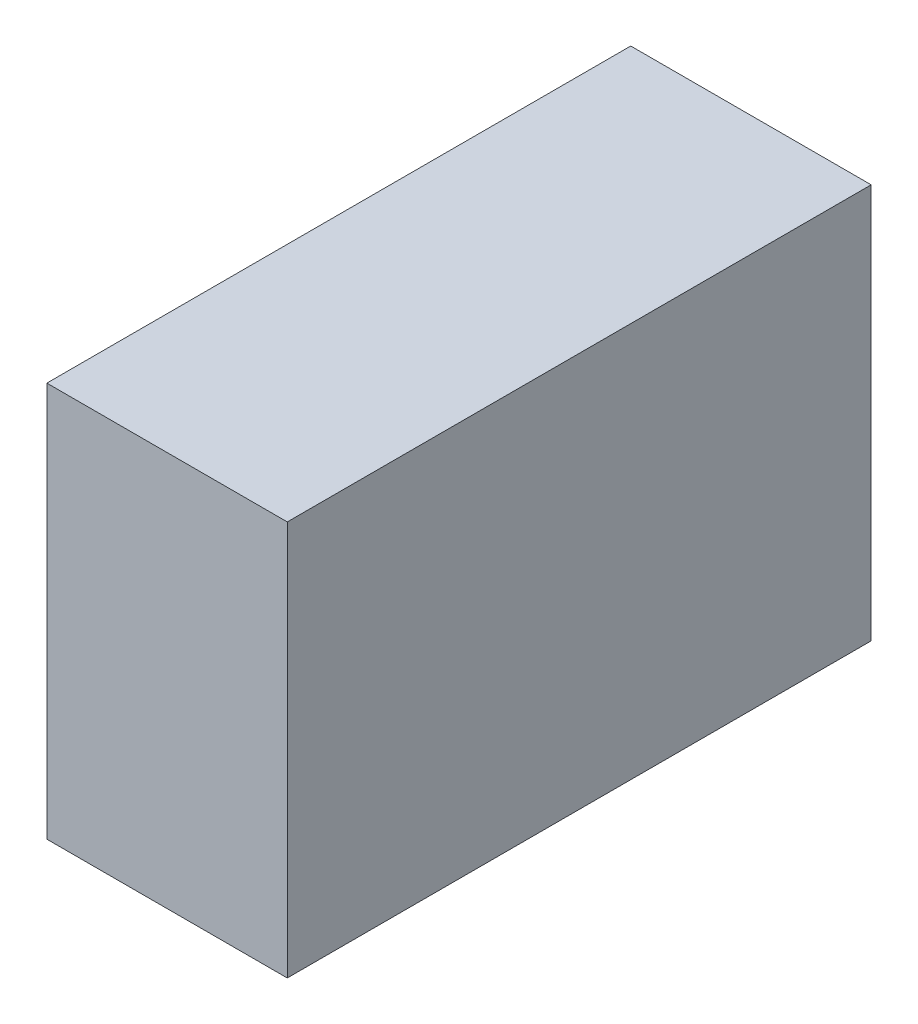
ISO-10303-21;
HEADER;
FILE_DESCRIPTION(('STEP AP214'),'2;1');
FILE_NAME('part.step','',(''),(''),'','','');
FILE_SCHEMA(('AUTOMOTIVE_DESIGN { 1 0 10303 214 1 1 1 1 }'));
ENDSEC;
DATA;
#1=APPLICATION_CONTEXT('core data for automotive mechanical design processes');
#2=APPLICATION_PROTOCOL_DEFINITION('international standard','automotive_design',2000,#1);
#3=PRODUCT_CONTEXT('',#1,'mechanical');
#4=PRODUCT('Part','Part','',(#3));
#5=PRODUCT_RELATED_PRODUCT_CATEGORY('part','',(#4));
#6=PRODUCT_DEFINITION_FORMATION('','',#4);
#7=PRODUCT_DEFINITION_CONTEXT('part definition',#1,'design');
#8=PRODUCT_DEFINITION('design','',#6,#7);
#9=PRODUCT_DEFINITION_SHAPE('','',#8);
#10=(LENGTH_UNIT() NAMED_UNIT(*) SI_UNIT(.MILLI.,.METRE.));
#11=(NAMED_UNIT(*) PLANE_ANGLE_UNIT() SI_UNIT($,.RADIAN.));
#12=(NAMED_UNIT(*) SI_UNIT($,.STERADIAN.) SOLID_ANGLE_UNIT());
#13=UNCERTAINTY_MEASURE_WITH_UNIT(LENGTH_MEASURE(1.E-05),#10,'distance_accuracy_value','');
#14=(GEOMETRIC_REPRESENTATION_CONTEXT(3) GLOBAL_UNCERTAINTY_ASSIGNED_CONTEXT((#13)) GLOBAL_UNIT_ASSIGNED_CONTEXT((#10,
#11,#12)) REPRESENTATION_CONTEXT('',''));
#15=CARTESIAN_POINT('',(0.,0.,0.));
#16=DIRECTION('',(0.,0.,1.));
#17=DIRECTION('',(1.,0.,0.));
#18=AXIS2_PLACEMENT_3D('',#15,#16,#17);
#19=CARTESIAN_POINT('',(35.56,0.,0.));
#20=DIRECTION('',(0.,0.,-1.));
#21=DIRECTION('',(-1.,0.,0.));
#22=AXIS2_PLACEMENT_3D('',#19,#20,#21);
#23=PLANE('',#22);
#24=DIRECTION('',(0.,-1.,0.));
#25=VECTOR('',#24,1.);
#26=CARTESIAN_POINT('',(0.,0.,0.));
#27=LINE('',#26,#25);
#28=CARTESIAN_POINT('',(0.,58.42,0.));
#29=VERTEX_POINT('',#28);
#30=CARTESIAN_POINT('',(0.,0.,0.));
#31=VERTEX_POINT('',#30);
#32=EDGE_CURVE('E107',#29,#31,#27,.T.);
#33=ORIENTED_EDGE('',*,*,#32,.T.);
#34=DIRECTION('',(-1.,0.,0.));
#35=VECTOR('',#34,1.);
#36=CARTESIAN_POINT('',(35.56,0.,0.));
#37=LINE('',#36,#35);
#38=CARTESIAN_POINT('',(35.56,0.,0.));
#39=VERTEX_POINT('',#38);
#40=EDGE_CURVE('E11',#39,#31,#37,.T.);
#41=ORIENTED_EDGE('',*,*,#40,.F.);
#42=DIRECTION('',(0.,-1.,0.));
#43=VECTOR('',#42,1.);
#44=CARTESIAN_POINT('',(35.56,0.,0.));
#45=LINE('',#44,#43);
#46=CARTESIAN_POINT('',(35.56,58.42,0.));
#47=VERTEX_POINT('',#46);
#48=EDGE_CURVE('E91',#47,#39,#45,.T.);
#49=ORIENTED_EDGE('',*,*,#48,.F.);
#50=DIRECTION('',(-1.,0.,0.));
#51=VECTOR('',#50,1.);
#52=CARTESIAN_POINT('',(35.56,58.42,0.));
#53=LINE('',#52,#51);
#54=EDGE_CURVE('E103',#47,#29,#53,.T.);
#55=ORIENTED_EDGE('',*,*,#54,.T.);
#56=EDGE_LOOP('',(#33,#41,#49,#55));
#57=FACE_BOUND('',#56,.T.);
#58=ADVANCED_FACE('F39',(#57),#23,.F.);
#59=CARTESIAN_POINT('',(35.56,0.,0.));
#60=DIRECTION('',(0.,1.,0.));
#61=DIRECTION('',(0.,0.,1.));
#62=AXIS2_PLACEMENT_3D('',#59,#60,#61);
#63=PLANE('',#62);
#64=DIRECTION('',(0.,0.,-1.));
#65=VECTOR('',#64,1.);
#66=CARTESIAN_POINT('',(0.,0.,0.));
#67=LINE('',#66,#65);
#68=CARTESIAN_POINT('',(0.,0.,-86.36));
#69=VERTEX_POINT('',#68);
#70=EDGE_CURVE('E96',#31,#69,#67,.T.);
#71=ORIENTED_EDGE('',*,*,#70,.T.);
#72=DIRECTION('',(-1.,0.,0.));
#73=VECTOR('',#72,1.);
#74=CARTESIAN_POINT('',(35.56,0.,-86.36));
#75=LINE('',#74,#73);
#76=CARTESIAN_POINT('',(35.56,0.,-86.36));
#77=VERTEX_POINT('',#76);
#78=EDGE_CURVE('E48',#77,#69,#75,.T.);
#79=ORIENTED_EDGE('',*,*,#78,.F.);
#80=DIRECTION('',(0.,0.,-1.));
#81=VECTOR('',#80,1.);
#82=CARTESIAN_POINT('',(35.56,0.,0.));
#83=LINE('',#82,#81);
#84=EDGE_CURVE('E86',#39,#77,#83,.T.);
#85=ORIENTED_EDGE('',*,*,#84,.F.);
#86=ORIENTED_EDGE('',*,*,#40,.T.);
#87=EDGE_LOOP('',(#71,#79,#85,#86));
#88=FACE_BOUND('',#87,.T.);
#89=ADVANCED_FACE('F95',(#88),#63,.F.);
#90=CARTESIAN_POINT('',(35.56,0.,-86.36));
#91=DIRECTION('',(0.,0.,1.));
#92=DIRECTION('',(1.,0.,0.));
#93=AXIS2_PLACEMENT_3D('',#90,#91,#92);
#94=PLANE('',#93);
#95=DIRECTION('',(0.,1.,0.));
#96=VECTOR('',#95,1.);
#97=CARTESIAN_POINT('',(0.,0.,-86.36));
#98=LINE('',#97,#96);
#99=CARTESIAN_POINT('',(0.,58.42,-86.36));
#100=VERTEX_POINT('',#99);
#101=EDGE_CURVE('E73',#69,#100,#98,.T.);
#102=ORIENTED_EDGE('',*,*,#101,.T.);
#103=DIRECTION('',(-1.,0.,0.));
#104=VECTOR('',#103,1.);
#105=CARTESIAN_POINT('',(35.56,58.42,-86.36));
#106=LINE('',#105,#104);
#107=CARTESIAN_POINT('',(35.56,58.42,-86.36));
#108=VERTEX_POINT('',#107);
#109=EDGE_CURVE('E98',#108,#100,#106,.T.);
#110=ORIENTED_EDGE('',*,*,#109,.F.);
#111=DIRECTION('',(0.,1.,0.));
#112=VECTOR('',#111,1.);
#113=CARTESIAN_POINT('',(35.56,0.,-86.36));
#114=LINE('',#113,#112);
#115=EDGE_CURVE('E89',#77,#108,#114,.T.);
#116=ORIENTED_EDGE('',*,*,#115,.F.);
#117=ORIENTED_EDGE('',*,*,#78,.T.);
#118=EDGE_LOOP('',(#102,#110,#116,#117));
#119=FACE_BOUND('',#118,.T.);
#120=ADVANCED_FACE('F99',(#119),#94,.F.);
#121=CARTESIAN_POINT('',(35.56,58.42,0.));
#122=DIRECTION('',(0.,-1.,0.));
#123=DIRECTION('',(0.,0.,-1.));
#124=AXIS2_PLACEMENT_3D('',#121,#122,#123);
#125=PLANE('',#124);
#126=DIRECTION('',(0.,0.,1.));
#127=VECTOR('',#126,1.);
#128=CARTESIAN_POINT('',(0.,58.42,0.));
#129=LINE('',#128,#127);
#130=EDGE_CURVE('E79',#100,#29,#129,.T.);
#131=ORIENTED_EDGE('',*,*,#130,.T.);
#132=ORIENTED_EDGE('',*,*,#54,.F.);
#133=DIRECTION('',(0.,0.,1.));
#134=VECTOR('',#133,1.);
#135=CARTESIAN_POINT('',(35.56,58.42,0.));
#136=LINE('',#135,#134);
#137=EDGE_CURVE('E56',#108,#47,#136,.T.);
#138=ORIENTED_EDGE('',*,*,#137,.F.);
#139=ORIENTED_EDGE('',*,*,#109,.T.);
#140=EDGE_LOOP('',(#131,#132,#138,#139));
#141=FACE_BOUND('',#140,.T.);
#142=ADVANCED_FACE('F120',(#141),#125,.F.);
#143=CARTESIAN_POINT('',(35.56,0.,0.));
#144=DIRECTION('',(-1.,0.,0.));
#145=DIRECTION('',(0.,0.,1.));
#146=AXIS2_PLACEMENT_3D('',#143,#144,#145);
#147=PLANE('',#146);
#148=ORIENTED_EDGE('',*,*,#48,.T.);
#149=ORIENTED_EDGE('',*,*,#84,.T.);
#150=ORIENTED_EDGE('',*,*,#115,.T.);
#151=ORIENTED_EDGE('',*,*,#137,.T.);
#152=EDGE_LOOP('',(#148,#149,#150,#151));
#153=FACE_BOUND('',#152,.T.);
#154=ADVANCED_FACE('F87',(#153),#147,.F.);
#155=CARTESIAN_POINT('',(0.,0.,0.));
#156=DIRECTION('',(-1.,0.,0.));
#157=DIRECTION('',(0.,0.,1.));
#158=AXIS2_PLACEMENT_3D('',#155,#156,#157);
#159=PLANE('',#158);
#160=ORIENTED_EDGE('',*,*,#32,.F.);
#161=ORIENTED_EDGE('',*,*,#130,.F.);
#162=ORIENTED_EDGE('',*,*,#101,.F.);
#163=ORIENTED_EDGE('',*,*,#70,.F.);
#164=EDGE_LOOP('',(#160,#161,#162,#163));
#165=FACE_BOUND('',#164,.T.);
#166=ADVANCED_FACE('F123',(#165),#159,.T.);
#167=CLOSED_SHELL('',(#58,#89,#120,#142,#154,#166));
#168=MANIFOLD_SOLID_BREP('B2',#167);
#169=ADVANCED_BREP_SHAPE_REPRESENTATION('',(#18,#168),#14);
#170=SHAPE_DEFINITION_REPRESENTATION(#9,#169);
ENDSEC;
END-ISO-10303-21;
